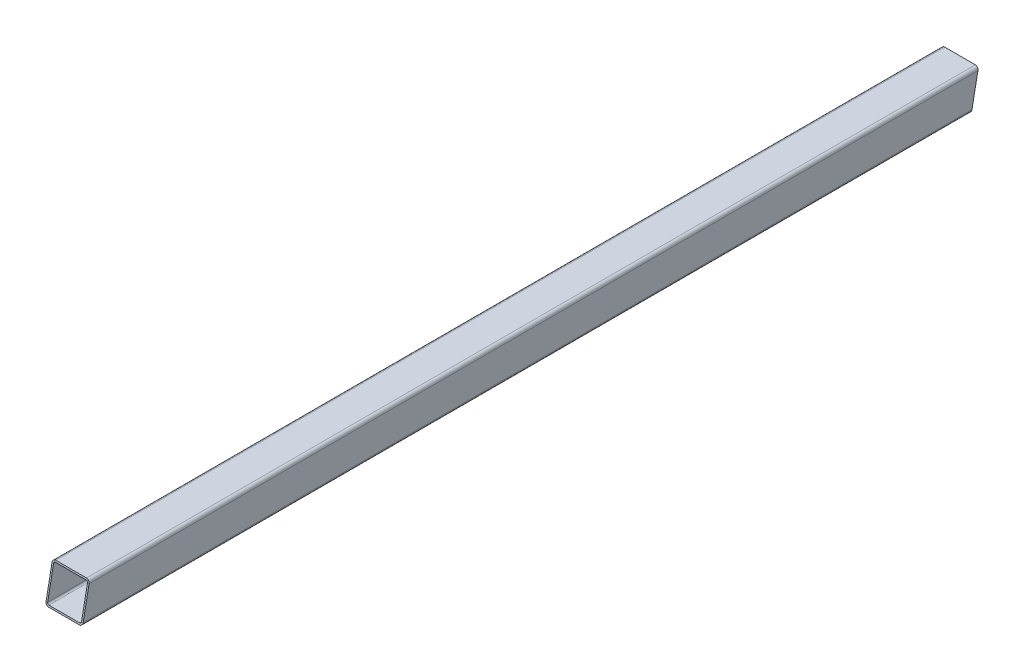
ISO-10303-21;
HEADER;
FILE_DESCRIPTION(('STEP AP214'),'2;1');
FILE_NAME('part.step','',(''),(''),'','','');
FILE_SCHEMA(('AUTOMOTIVE_DESIGN { 1 0 10303 214 1 1 1 1 }'));
ENDSEC;
DATA;
#1=APPLICATION_CONTEXT('core data for automotive mechanical design processes');
#2=APPLICATION_PROTOCOL_DEFINITION('international standard','automotive_design',2000,#1);
#3=PRODUCT_CONTEXT('',#1,'mechanical');
#4=PRODUCT('Part','Part','',(#3));
#5=PRODUCT_RELATED_PRODUCT_CATEGORY('part','',(#4));
#6=PRODUCT_DEFINITION_FORMATION('','',#4);
#7=PRODUCT_DEFINITION_CONTEXT('part definition',#1,'design');
#8=PRODUCT_DEFINITION('design','',#6,#7);
#9=PRODUCT_DEFINITION_SHAPE('','',#8);
#10=(LENGTH_UNIT() NAMED_UNIT(*) SI_UNIT(.MILLI.,.METRE.));
#11=(NAMED_UNIT(*) PLANE_ANGLE_UNIT() SI_UNIT($,.RADIAN.));
#12=(NAMED_UNIT(*) SI_UNIT($,.STERADIAN.) SOLID_ANGLE_UNIT());
#13=UNCERTAINTY_MEASURE_WITH_UNIT(LENGTH_MEASURE(1.E-05),#10,'distance_accuracy_value','');
#14=(GEOMETRIC_REPRESENTATION_CONTEXT(3) GLOBAL_UNCERTAINTY_ASSIGNED_CONTEXT((#13)) GLOBAL_UNIT_ASSIGNED_CONTEXT((#10,
#11,#12)) REPRESENTATION_CONTEXT('',''));
#15=CARTESIAN_POINT('',(0.,0.,0.));
#16=DIRECTION('',(0.,0.,1.));
#17=DIRECTION('',(1.,0.,0.));
#18=AXIS2_PLACEMENT_3D('',#15,#16,#17);
#19=CARTESIAN_POINT('',(20.4670487106017,0.,1693.));
#20=DIRECTION('',(1.,0.,0.));
#21=DIRECTION('',(0.,1.,0.));
#22=AXIS2_PLACEMENT_3D('',#19,#20,#21);
#23=PLANE('',#22);
#24=DIRECTION('',(0.,0.,-1.));
#25=VECTOR('',#24,1.);
#26=CARTESIAN_POINT('',(20.4670487106017,-26.9856733524355,1693.));
#27=LINE('',#26,#25);
#28=CARTESIAN_POINT('',(20.4670487106017,-26.9856733524355,1691.83428571429));
#29=VERTEX_POINT('',#28);
#30=CARTESIAN_POINT('',(20.4670487106017,-26.9856733524355,12.4342857142856));
#31=VERTEX_POINT('',#30);
#32=EDGE_CURVE('E365',#29,#31,#27,.T.);
#33=ORIENTED_EDGE('',*,*,#32,.F.);
#34=DIRECTION('',(0.,0.981644572077095,-0.190719516860694));
#35=VECTOR('',#34,1.);
#36=CARTESIAN_POINT('',(20.4670487106017,-1.19981870914747,1686.82446252645));
#37=LINE('',#36,#35);
#38=CARTESIAN_POINT('',(20.4670487106017,31.0143266475644,1680.56571428571));
#39=VERTEX_POINT('',#38);
#40=EDGE_CURVE('E435',#29,#39,#37,.T.);
#41=ORIENTED_EDGE('',*,*,#40,.T.);
#42=DIRECTION('',(0.,0.,-1.));
#43=VECTOR('',#42,1.);
#44=CARTESIAN_POINT('',(20.4670487106017,31.0143266475644,1693.));
#45=LINE('',#44,#43);
#46=CARTESIAN_POINT('',(20.4670487106017,31.0143266475644,1.16571428571444));
#47=VERTEX_POINT('',#46);
#48=EDGE_CURVE('E209',#39,#47,#45,.T.);
#49=ORIENTED_EDGE('',*,*,#48,.T.);
#50=DIRECTION('',(0.,-0.981644572077096,0.190719516860693));
#51=VECTOR('',#50,1.);
#52=CARTESIAN_POINT('',(20.4670487106018,-315.61503534802,68.5108474734282));
#53=LINE('',#52,#51);
#54=EDGE_CURVE('E381',#47,#31,#53,.T.);
#55=ORIENTED_EDGE('',*,*,#54,.T.);
#56=EDGE_LOOP('',(#33,#41,#49,#55));
#57=FACE_BOUND('',#56,.T.);
#58=ADVANCED_FACE('F185',(#57),#23,.F.);
#59=CARTESIAN_POINT('',(17.4670487106017,-26.9856733524355,1693.));
#60=DIRECTION('',(0.,0.,-1.));
#61=DIRECTION('',(-1.,0.,0.));
#62=AXIS2_PLACEMENT_3D('',#59,#60,#61);
#63=CYLINDRICAL_SURFACE('',#62,3.);
#64=DIRECTION('',(0.,0.,-1.));
#65=VECTOR('',#64,1.);
#66=CARTESIAN_POINT('',(17.4670487106017,-29.9856733524355,1693.));
#67=LINE('',#66,#65);
#68=CARTESIAN_POINT('',(17.4670487106017,-29.9856733524355,1692.41714285714));
#69=VERTEX_POINT('',#68);
#70=CARTESIAN_POINT('',(17.4670487106017,-29.9856733524355,13.0171428571431));
#71=VERTEX_POINT('',#70);
#72=EDGE_CURVE('E362',#69,#71,#67,.T.);
#73=ORIENTED_EDGE('',*,*,#72,.F.);
#74=CARTESIAN_POINT('',(17.4670487106017,-26.9856733524355,1691.83428571429));
#75=DIRECTION('',(0.,-0.190719516860694,-0.981644572077095));
#76=DIRECTION('',(0.,0.981644572077095,-0.190719516860694));
#77=AXIS2_PLACEMENT_3D('',#74,#75,#76);
#78=ELLIPSE('',#77,3.0560959489158,3.);
#79=EDGE_CURVE('E438',#69,#29,#78,.F.);
#80=ORIENTED_EDGE('',*,*,#79,.T.);
#81=ORIENTED_EDGE('',*,*,#32,.T.);
#82=CARTESIAN_POINT('',(17.4670487106017,-26.9856733524355,12.4342857142856));
#83=DIRECTION('',(0.,0.190719516860693,0.981644572077096));
#84=DIRECTION('',(0.,0.981644572077096,-0.190719516860693));
#85=AXIS2_PLACEMENT_3D('',#82,#83,#84);
#86=ELLIPSE('',#85,3.0560959489158,3.);
#87=EDGE_CURVE('E386',#31,#71,#86,.F.);
#88=ORIENTED_EDGE('',*,*,#87,.T.);
#89=EDGE_LOOP('',(#73,#80,#81,#88));
#90=FACE_BOUND('',#89,.T.);
#91=ADVANCED_FACE('F507',(#90),#63,.F.);
#92=CARTESIAN_POINT('',(0.,-29.9856733524355,1693.));
#93=DIRECTION('',(0.,-1.,0.));
#94=DIRECTION('',(1.,0.,0.));
#95=AXIS2_PLACEMENT_3D('',#92,#93,#94);
#96=PLANE('',#95);
#97=DIRECTION('',(0.,0.,-1.));
#98=VECTOR('',#97,1.);
#99=CARTESIAN_POINT('',(-40.5329512893982,-29.9856733524355,1693.));
#100=LINE('',#99,#98);
#101=CARTESIAN_POINT('',(-40.5329512893982,-29.9856733524355,1692.41714285714));
#102=VERTEX_POINT('',#101);
#103=CARTESIAN_POINT('',(-40.5329512893982,-29.9856733524355,13.0171428571428));
#104=VERTEX_POINT('',#103);
#105=EDGE_CURVE('E359',#102,#104,#100,.T.);
#106=ORIENTED_EDGE('',*,*,#105,.F.);
#107=DIRECTION('',(1.,0.,0.));
#108=VECTOR('',#107,1.);
#109=CARTESIAN_POINT('',(0.,-29.9856733524355,1692.41714285714));
#110=LINE('',#109,#108);
#111=EDGE_CURVE('E442',#102,#69,#110,.T.);
#112=ORIENTED_EDGE('',*,*,#111,.T.);
#113=ORIENTED_EDGE('',*,*,#72,.T.);
#114=DIRECTION('',(-1.,0.,0.));
#115=VECTOR('',#114,1.);
#116=CARTESIAN_POINT('',(0.,-29.9856733524355,13.0171428571431));
#117=LINE('',#116,#115);
#118=EDGE_CURVE('E390',#71,#104,#117,.T.);
#119=ORIENTED_EDGE('',*,*,#118,.T.);
#120=EDGE_LOOP('',(#106,#112,#113,#119));
#121=FACE_BOUND('',#120,.T.);
#122=ADVANCED_FACE('F511',(#121),#96,.F.);
#123=CARTESIAN_POINT('',(-40.5329512893983,-26.9856733524355,1693.));
#124=DIRECTION('',(0.,0.,-1.));
#125=DIRECTION('',(-1.,0.,0.));
#126=AXIS2_PLACEMENT_3D('',#123,#124,#125);
#127=CYLINDRICAL_SURFACE('',#126,3.);
#128=DIRECTION('',(0.,0.,-1.));
#129=VECTOR('',#128,1.);
#130=CARTESIAN_POINT('',(-43.5329512893983,-26.9856733524355,1693.));
#131=LINE('',#130,#129);
#132=CARTESIAN_POINT('',(-43.5329512893983,-26.9856733524355,1691.83428571429));
#133=VERTEX_POINT('',#132);
#134=CARTESIAN_POINT('',(-43.5329512893983,-26.9856733524355,12.4342857142861));
#135=VERTEX_POINT('',#134);
#136=EDGE_CURVE('E356',#133,#135,#131,.T.);
#137=ORIENTED_EDGE('',*,*,#136,.F.);
#138=CARTESIAN_POINT('',(-40.5329512893983,-26.9856733524355,1691.83428571429));
#139=DIRECTION('',(0.,-0.190719516860694,-0.981644572077095));
#140=DIRECTION('',(0.,0.981644572077095,-0.190719516860694));
#141=AXIS2_PLACEMENT_3D('',#138,#139,#140);
#142=ELLIPSE('',#141,3.05609594891581,3.);
#143=EDGE_CURVE('E446',#133,#102,#142,.F.);
#144=ORIENTED_EDGE('',*,*,#143,.T.);
#145=ORIENTED_EDGE('',*,*,#105,.T.);
#146=CARTESIAN_POINT('',(-40.5329512893983,-26.9856733524355,12.4342857142856));
#147=DIRECTION('',(0.,0.190719516860693,0.981644572077096));
#148=DIRECTION('',(0.,0.981644572077096,-0.190719516860693));
#149=AXIS2_PLACEMENT_3D('',#146,#147,#148);
#150=ELLIPSE('',#149,3.05609594891581,3.);
#151=EDGE_CURVE('E394',#104,#135,#150,.F.);
#152=ORIENTED_EDGE('',*,*,#151,.T.);
#153=EDGE_LOOP('',(#137,#144,#145,#152));
#154=FACE_BOUND('',#153,.T.);
#155=ADVANCED_FACE('F518',(#154),#127,.F.);
#156=CARTESIAN_POINT('',(-43.5329512893983,0.,1693.));
#157=DIRECTION('',(1.,0.,0.));
#158=DIRECTION('',(0.,0.,-1.));
#159=AXIS2_PLACEMENT_3D('',#156,#157,#158);
#160=PLANE('',#159);
#161=DIRECTION('',(0.,0.981644572077095,-0.190719516860694));
#162=VECTOR('',#161,1.);
#163=CARTESIAN_POINT('',(-43.5329512893983,-1.19981870914747,1686.82446252645));
#164=LINE('',#163,#162);
#165=CARTESIAN_POINT('',(-43.5329512893983,31.0143266475644,1680.56571428571));
#166=VERTEX_POINT('',#165);
#167=EDGE_CURVE('E450',#133,#166,#164,.T.);
#168=ORIENTED_EDGE('',*,*,#167,.F.);
#169=ORIENTED_EDGE('',*,*,#136,.T.);
#170=DIRECTION('',(0.,-0.981644572077096,0.190719516860693));
#171=VECTOR('',#170,1.);
#172=CARTESIAN_POINT('',(-43.5329512893983,-315.61503534802,68.5108474734282));
#173=LINE('',#172,#171);
#174=CARTESIAN_POINT('',(-43.5329512893983,31.0143266475644,1.16571428571444));
#175=VERTEX_POINT('',#174);
#176=EDGE_CURVE('E398',#175,#135,#173,.T.);
#177=ORIENTED_EDGE('',*,*,#176,.F.);
#178=DIRECTION('',(0.,0.,-1.));
#179=VECTOR('',#178,1.);
#180=CARTESIAN_POINT('',(-43.5329512893983,31.0143266475644,1693.));
#181=LINE('',#180,#179);
#182=EDGE_CURVE('E353',#166,#175,#181,.T.);
#183=ORIENTED_EDGE('',*,*,#182,.F.);
#184=EDGE_LOOP('',(#168,#169,#177,#183));
#185=FACE_BOUND('',#184,.T.);
#186=ADVANCED_FACE('F522',(#185),#160,.T.);
#187=CARTESIAN_POINT('',(-40.5329512893983,31.0143266475645,1693.));
#188=DIRECTION('',(0.,0.,-1.));
#189=DIRECTION('',(-1.,0.,0.));
#190=AXIS2_PLACEMENT_3D('',#187,#188,#189);
#191=CYLINDRICAL_SURFACE('',#190,3.);
#192=DIRECTION('',(0.,0.,-1.));
#193=VECTOR('',#192,1.);
#194=CARTESIAN_POINT('',(-40.5329512893982,34.0143266475645,1693.));
#195=LINE('',#194,#193);
#196=CARTESIAN_POINT('',(-40.5329512893982,34.0143266475645,1679.98285714286));
#197=VERTEX_POINT('',#196);
#198=CARTESIAN_POINT('',(-40.5329512893982,34.0143266475645,0.582857142857218));
#199=VERTEX_POINT('',#198);
#200=EDGE_CURVE('E350',#197,#199,#195,.T.);
#201=ORIENTED_EDGE('',*,*,#200,.F.);
#202=CARTESIAN_POINT('',(-40.5329512893983,31.0143266475645,1680.56571428571));
#203=DIRECTION('',(0.,-0.190719516860694,-0.981644572077095));
#204=DIRECTION('',(0.,0.981644572077095,-0.190719516860694));
#205=AXIS2_PLACEMENT_3D('',#202,#203,#204);
#206=ELLIPSE('',#205,3.05609594891581,3.);
#207=EDGE_CURVE('E453',#197,#166,#206,.F.);
#208=ORIENTED_EDGE('',*,*,#207,.T.);
#209=ORIENTED_EDGE('',*,*,#182,.T.);
#210=CARTESIAN_POINT('',(-40.5329512893983,31.0143266475645,1.16571428571444));
#211=DIRECTION('',(0.,0.190719516860693,0.981644572077096));
#212=DIRECTION('',(0.,0.981644572077096,-0.190719516860693));
#213=AXIS2_PLACEMENT_3D('',#210,#211,#212);
#214=ELLIPSE('',#213,3.05609594891581,3.);
#215=EDGE_CURVE('E402',#175,#199,#214,.F.);
#216=ORIENTED_EDGE('',*,*,#215,.T.);
#217=EDGE_LOOP('',(#201,#208,#209,#216));
#218=FACE_BOUND('',#217,.T.);
#219=ADVANCED_FACE('F526',(#218),#191,.F.);
#220=CARTESIAN_POINT('',(0.,34.0143266475645,1693.));
#221=DIRECTION('',(0.,-1.,0.));
#222=DIRECTION('',(1.,0.,0.));
#223=AXIS2_PLACEMENT_3D('',#220,#221,#222);
#224=PLANE('',#223);
#225=DIRECTION('',(1.,0.,0.));
#226=VECTOR('',#225,1.);
#227=CARTESIAN_POINT('',(0.,34.0143266475645,1679.98285714286));
#228=LINE('',#227,#226);
#229=CARTESIAN_POINT('',(17.4670487106017,34.0143266475645,1679.98285714286));
#230=VERTEX_POINT('',#229);
#231=EDGE_CURVE('E201',#197,#230,#228,.T.);
#232=ORIENTED_EDGE('',*,*,#231,.F.);
#233=ORIENTED_EDGE('',*,*,#200,.T.);
#234=DIRECTION('',(-1.,0.,0.));
#235=VECTOR('',#234,1.);
#236=CARTESIAN_POINT('',(0.,34.0143266475645,0.582857142857218));
#237=LINE('',#236,#235);
#238=CARTESIAN_POINT('',(17.4670487106017,34.0143266475645,0.58285714285744));
#239=VERTEX_POINT('',#238);
#240=EDGE_CURVE('E406',#239,#199,#237,.T.);
#241=ORIENTED_EDGE('',*,*,#240,.F.);
#242=DIRECTION('',(0.,0.,-1.));
#243=VECTOR('',#242,1.);
#244=CARTESIAN_POINT('',(17.4670487106017,34.0143266475645,1693.));
#245=LINE('',#244,#243);
#246=EDGE_CURVE('E347',#230,#239,#245,.T.);
#247=ORIENTED_EDGE('',*,*,#246,.F.);
#248=EDGE_LOOP('',(#232,#233,#241,#247));
#249=FACE_BOUND('',#248,.T.);
#250=ADVANCED_FACE('F530',(#249),#224,.T.);
#251=CARTESIAN_POINT('',(17.4670487106017,31.0143266475645,1693.));
#252=DIRECTION('',(0.,0.,-1.));
#253=DIRECTION('',(-1.,0.,0.));
#254=AXIS2_PLACEMENT_3D('',#251,#252,#253);
#255=CYLINDRICAL_SURFACE('',#254,3.);
#256=CARTESIAN_POINT('',(17.4670487106017,31.0143266475645,1680.56571428571));
#257=DIRECTION('',(0.,-0.190719516860694,-0.981644572077095));
#258=DIRECTION('',(0.,0.981644572077095,-0.190719516860694));
#259=AXIS2_PLACEMENT_3D('',#256,#257,#258);
#260=ELLIPSE('',#259,3.0560959489158,3.);
#261=EDGE_CURVE('E459',#230,#39,#260,.T.);
#262=ORIENTED_EDGE('',*,*,#261,.F.);
#263=ORIENTED_EDGE('',*,*,#246,.T.);
#264=CARTESIAN_POINT('',(17.4670487106017,31.0143266475645,1.16571428571444));
#265=DIRECTION('',(0.,0.190719516860693,0.981644572077096));
#266=DIRECTION('',(0.,0.981644572077096,-0.190719516860693));
#267=AXIS2_PLACEMENT_3D('',#264,#265,#266);
#268=ELLIPSE('',#267,3.0560959489158,3.);
#269=EDGE_CURVE('E410',#47,#239,#268,.T.);
#270=ORIENTED_EDGE('',*,*,#269,.F.);
#271=ORIENTED_EDGE('',*,*,#48,.F.);
#272=EDGE_LOOP('',(#262,#263,#270,#271));
#273=FACE_BOUND('',#272,.T.);
#274=ADVANCED_FACE('F187',(#273),#255,.F.);
#275=CARTESIAN_POINT('',(0.,37.0143266475645,1693.));
#276=DIRECTION('',(0.,-1.,0.));
#277=DIRECTION('',(1.,0.,0.));
#278=AXIS2_PLACEMENT_3D('',#275,#276,#277);
#279=PLANE('',#278);
#280=DIRECTION('',(0.,0.,-1.));
#281=VECTOR('',#280,1.);
#282=CARTESIAN_POINT('',(-40.5329512893982,37.0143266475645,1693.));
#283=LINE('',#282,#281);
#284=CARTESIAN_POINT('',(-40.5329512893983,37.0143266475645,1679.4));
#285=VERTEX_POINT('',#284);
#286=CARTESIAN_POINT('',(-40.5329512893983,37.0143266475645,1.51354623278976E-13));
#287=VERTEX_POINT('',#286);
#288=EDGE_CURVE('E368',#285,#287,#283,.T.);
#289=ORIENTED_EDGE('',*,*,#288,.F.);
#290=DIRECTION('',(1.,0.,0.));
#291=VECTOR('',#290,1.);
#292=CARTESIAN_POINT('',(-1190.5329512894,37.0143266475643,1679.4));
#293=LINE('',#292,#291);
#294=CARTESIAN_POINT('',(17.4670487106017,37.0143266475645,1679.4));
#295=VERTEX_POINT('',#294);
#296=EDGE_CURVE('E323',#285,#295,#293,.T.);
#297=ORIENTED_EDGE('',*,*,#296,.T.);
#298=DIRECTION('',(0.,0.,-1.));
#299=VECTOR('',#298,1.);
#300=CARTESIAN_POINT('',(17.4670487106017,37.0143266475645,1693.));
#301=LINE('',#300,#299);
#302=CARTESIAN_POINT('',(17.4670487106017,37.0143266475645,1.50920942409982E-13));
#303=VERTEX_POINT('',#302);
#304=EDGE_CURVE('E335',#295,#303,#301,.T.);
#305=ORIENTED_EDGE('',*,*,#304,.T.);
#306=DIRECTION('',(-1.,0.,0.));
#307=VECTOR('',#306,1.);
#308=CARTESIAN_POINT('',(0.,37.0143266475645,0.));
#309=LINE('',#308,#307);
#310=EDGE_CURVE('E377',#303,#287,#309,.T.);
#311=ORIENTED_EDGE('',*,*,#310,.T.);
#312=EDGE_LOOP('',(#289,#297,#305,#311));
#313=FACE_BOUND('',#312,.T.);
#314=ADVANCED_FACE('F477',(#313),#279,.F.);
#315=CARTESIAN_POINT('',(17.4670487106017,31.0143266475645,1693.));
#316=DIRECTION('',(0.,0.,-1.));
#317=DIRECTION('',(-1.,0.,0.));
#318=AXIS2_PLACEMENT_3D('',#315,#316,#317);
#319=CYLINDRICAL_SURFACE('',#318,6.);
#320=CARTESIAN_POINT('',(17.4670487106017,31.0143266475645,1680.56571428571));
#321=DIRECTION('',(0.,-0.190719516860694,-0.981644572077095));
#322=DIRECTION('',(0.,0.981644572077095,-0.190719516860694));
#323=AXIS2_PLACEMENT_3D('',#320,#321,#322);
#324=ELLIPSE('',#323,6.11219189783161,6.);
#325=CARTESIAN_POINT('',(23.4670487106017,31.0143266475644,1680.56571428571));
#326=VERTEX_POINT('',#325);
#327=EDGE_CURVE('E312',#326,#295,#324,.F.);
#328=ORIENTED_EDGE('',*,*,#327,.F.);
#329=DIRECTION('',(0.,0.,-1.));
#330=VECTOR('',#329,1.);
#331=CARTESIAN_POINT('',(23.4670487106017,31.0143266475644,1693.));
#332=LINE('',#331,#330);
#333=CARTESIAN_POINT('',(23.4670487106017,31.0143266475644,1.1657142857143));
#334=VERTEX_POINT('',#333);
#335=EDGE_CURVE('E321',#326,#334,#332,.T.);
#336=ORIENTED_EDGE('',*,*,#335,.T.);
#337=CARTESIAN_POINT('',(17.4670487106017,31.0143266475645,1.16571428571444));
#338=DIRECTION('',(0.,0.190719516860693,0.981644572077096));
#339=DIRECTION('',(0.,0.981644572077096,-0.190719516860693));
#340=AXIS2_PLACEMENT_3D('',#337,#338,#339);
#341=ELLIPSE('',#340,6.11219189783161,6.);
#342=EDGE_CURVE('E414',#303,#334,#341,.F.);
#343=ORIENTED_EDGE('',*,*,#342,.F.);
#344=ORIENTED_EDGE('',*,*,#304,.F.);
#345=EDGE_LOOP('',(#328,#336,#343,#344));
#346=FACE_BOUND('',#345,.T.);
#347=ADVANCED_FACE('F481',(#346),#319,.T.);
#348=CARTESIAN_POINT('',(23.4670487106017,0.,1693.));
#349=DIRECTION('',(1.,0.,0.));
#350=DIRECTION('',(0.,1.,0.));
#351=AXIS2_PLACEMENT_3D('',#348,#349,#350);
#352=PLANE('',#351);
#353=DIRECTION('',(0.,0.981644572077095,-0.190719516860694));
#354=VECTOR('',#353,1.);
#355=CARTESIAN_POINT('',(23.4670487106017,37.0143266475645,1679.4));
#356=LINE('',#355,#354);
#357=CARTESIAN_POINT('',(23.4670487106017,-26.9856733524355,1691.83428571429));
#358=VERTEX_POINT('',#357);
#359=EDGE_CURVE('E303',#358,#326,#356,.T.);
#360=ORIENTED_EDGE('',*,*,#359,.F.);
#361=DIRECTION('',(0.,0.,-1.));
#362=VECTOR('',#361,1.);
#363=CARTESIAN_POINT('',(23.4670487106017,-26.9856733524355,1693.));
#364=LINE('',#363,#362);
#365=CARTESIAN_POINT('',(23.4670487106017,-26.9856733524355,12.4342857142857));
#366=VERTEX_POINT('',#365);
#367=EDGE_CURVE('E319',#358,#366,#364,.T.);
#368=ORIENTED_EDGE('',*,*,#367,.T.);
#369=DIRECTION('',(0.,-0.981644572077096,0.190719516860693));
#370=VECTOR('',#369,1.);
#371=CARTESIAN_POINT('',(23.4670487106017,-32.9856733524355,13.6));
#372=LINE('',#371,#370);
#373=EDGE_CURVE('E432',#334,#366,#372,.T.);
#374=ORIENTED_EDGE('',*,*,#373,.F.);
#375=ORIENTED_EDGE('',*,*,#335,.F.);
#376=EDGE_LOOP('',(#360,#368,#374,#375));
#377=FACE_BOUND('',#376,.T.);
#378=ADVANCED_FACE('F317',(#377),#352,.T.);
#379=CARTESIAN_POINT('',(17.4670487106017,-26.9856733524355,1693.));
#380=DIRECTION('',(0.,0.,-1.));
#381=DIRECTION('',(-1.,0.,0.));
#382=AXIS2_PLACEMENT_3D('',#379,#380,#381);
#383=CYLINDRICAL_SURFACE('',#382,6.);
#384=CARTESIAN_POINT('',(17.4670487106017,-26.9856733524355,1691.83428571429));
#385=DIRECTION('',(0.,-0.190719516860694,-0.981644572077095));
#386=DIRECTION('',(0.,0.981644572077095,-0.190719516860694));
#387=AXIS2_PLACEMENT_3D('',#384,#385,#386);
#388=ELLIPSE('',#387,6.11219189783161,6.);
#389=CARTESIAN_POINT('',(17.4670487106017,-32.9856733524355,1693.));
#390=VERTEX_POINT('',#389);
#391=EDGE_CURVE('E300',#390,#358,#388,.F.);
#392=ORIENTED_EDGE('',*,*,#391,.F.);
#393=DIRECTION('',(0.,0.,-1.));
#394=VECTOR('',#393,1.);
#395=CARTESIAN_POINT('',(17.4670487106017,-32.9856733524355,1693.));
#396=LINE('',#395,#394);
#397=CARTESIAN_POINT('',(17.4670487106017,-32.9856733524355,13.6));
#398=VERTEX_POINT('',#397);
#399=EDGE_CURVE('E329',#390,#398,#396,.T.);
#400=ORIENTED_EDGE('',*,*,#399,.T.);
#401=CARTESIAN_POINT('',(17.4670487106017,-26.9856733524355,12.4342857142856));
#402=DIRECTION('',(0.,0.190719516860693,0.981644572077096));
#403=DIRECTION('',(0.,0.981644572077096,-0.190719516860693));
#404=AXIS2_PLACEMENT_3D('',#401,#402,#403);
#405=ELLIPSE('',#404,6.11219189783161,6.);
#406=EDGE_CURVE('E327',#366,#398,#405,.F.);
#407=ORIENTED_EDGE('',*,*,#406,.F.);
#408=ORIENTED_EDGE('',*,*,#367,.F.);
#409=EDGE_LOOP('',(#392,#400,#407,#408));
#410=FACE_BOUND('',#409,.T.);
#411=ADVANCED_FACE('F326',(#410),#383,.T.);
#412=CARTESIAN_POINT('',(0.,-32.9856733524355,1693.));
#413=DIRECTION('',(0.,-1.,0.));
#414=DIRECTION('',(1.,0.,0.));
#415=AXIS2_PLACEMENT_3D('',#412,#413,#414);
#416=PLANE('',#415);
#417=DIRECTION('',(1.,0.,0.));
#418=VECTOR('',#417,1.);
#419=CARTESIAN_POINT('',(-1190.5329512894,-32.9856733524357,13.6));
#420=LINE('',#419,#418);
#421=CARTESIAN_POINT('',(-40.5329512893983,-32.9856733524355,13.5999999999999));
#422=VERTEX_POINT('',#421);
#423=EDGE_CURVE('E428',#422,#398,#420,.T.);
#424=ORIENTED_EDGE('',*,*,#423,.T.);
#425=ORIENTED_EDGE('',*,*,#399,.F.);
#426=DIRECTION('',(-1.,0.,0.));
#427=VECTOR('',#426,1.);
#428=CARTESIAN_POINT('',(0.,-32.9856733524355,1693.));
#429=LINE('',#428,#427);
#430=CARTESIAN_POINT('',(-40.5329512893982,-32.9856733524355,1693.));
#431=VERTEX_POINT('',#430);
#432=EDGE_CURVE('E306',#390,#431,#429,.T.);
#433=ORIENTED_EDGE('',*,*,#432,.T.);
#434=DIRECTION('',(0.,0.,-1.));
#435=VECTOR('',#434,1.);
#436=CARTESIAN_POINT('',(-40.5329512893982,-32.9856733524355,1693.));
#437=LINE('',#436,#435);
#438=EDGE_CURVE('E333',#431,#422,#437,.T.);
#439=ORIENTED_EDGE('',*,*,#438,.T.);
#440=EDGE_LOOP('',(#424,#425,#433,#439));
#441=FACE_BOUND('',#440,.T.);
#442=ADVANCED_FACE('F497',(#441),#416,.T.);
#443=CARTESIAN_POINT('',(-40.5329512893983,-26.9856733524355,1693.));
#444=DIRECTION('',(0.,0.,-1.));
#445=DIRECTION('',(-1.,0.,0.));
#446=AXIS2_PLACEMENT_3D('',#443,#444,#445);
#447=CYLINDRICAL_SURFACE('',#446,6.);
#448=CARTESIAN_POINT('',(-40.5329512893983,-26.9856733524355,1691.83428571429));
#449=DIRECTION('',(0.,-0.190719516860694,-0.981644572077095));
#450=DIRECTION('',(0.,0.981644572077095,-0.190719516860694));
#451=AXIS2_PLACEMENT_3D('',#448,#449,#450);
#452=ELLIPSE('',#451,6.11219189783161,6.);
#453=CARTESIAN_POINT('',(-46.5329512893983,-26.9856733524355,1691.83428571429));
#454=VERTEX_POINT('',#453);
#455=EDGE_CURVE('E313',#454,#431,#452,.F.);
#456=ORIENTED_EDGE('',*,*,#455,.F.);
#457=DIRECTION('',(0.,0.,-1.));
#458=VECTOR('',#457,1.);
#459=CARTESIAN_POINT('',(-46.5329512893983,-26.9856733524355,1693.));
#460=LINE('',#459,#458);
#461=CARTESIAN_POINT('',(-46.5329512893983,-26.9856733524355,12.4342857142861));
#462=VERTEX_POINT('',#461);
#463=EDGE_CURVE('E342',#454,#462,#460,.T.);
#464=ORIENTED_EDGE('',*,*,#463,.T.);
#465=CARTESIAN_POINT('',(-40.5329512893983,-26.9856733524355,12.4342857142856));
#466=DIRECTION('',(0.,0.190719516860693,0.981644572077096));
#467=DIRECTION('',(0.,0.981644572077096,-0.190719516860693));
#468=AXIS2_PLACEMENT_3D('',#465,#466,#467);
#469=ELLIPSE('',#468,6.11219189783161,6.);
#470=EDGE_CURVE('E420',#422,#462,#469,.F.);
#471=ORIENTED_EDGE('',*,*,#470,.F.);
#472=ORIENTED_EDGE('',*,*,#438,.F.);
#473=EDGE_LOOP('',(#456,#464,#471,#472));
#474=FACE_BOUND('',#473,.T.);
#475=ADVANCED_FACE('F494',(#474),#447,.T.);
#476=CARTESIAN_POINT('',(-46.5329512893983,0.,1693.));
#477=DIRECTION('',(1.,0.,0.));
#478=DIRECTION('',(0.,0.,-1.));
#479=AXIS2_PLACEMENT_3D('',#476,#477,#478);
#480=PLANE('',#479);
#481=ORIENTED_EDGE('',*,*,#463,.F.);
#482=DIRECTION('',(0.,0.981644572077095,-0.190719516860694));
#483=VECTOR('',#482,1.);
#484=CARTESIAN_POINT('',(-46.5329512893983,-1.19981870914747,1686.82446252645));
#485=LINE('',#484,#483);
#486=CARTESIAN_POINT('',(-46.5329512893983,31.0143266475644,1680.56571428571));
#487=VERTEX_POINT('',#486);
#488=EDGE_CURVE('E466',#454,#487,#485,.T.);
#489=ORIENTED_EDGE('',*,*,#488,.T.);
#490=DIRECTION('',(0.,0.,-1.));
#491=VECTOR('',#490,1.);
#492=CARTESIAN_POINT('',(-46.5329512893983,31.0143266475644,1693.));
#493=LINE('',#492,#491);
#494=CARTESIAN_POINT('',(-46.5329512893983,31.0143266475644,1.16571428571444));
#495=VERTEX_POINT('',#494);
#496=EDGE_CURVE('E194',#487,#495,#493,.T.);
#497=ORIENTED_EDGE('',*,*,#496,.T.);
#498=DIRECTION('',(0.,-0.981644572077096,0.190719516860693));
#499=VECTOR('',#498,1.);
#500=CARTESIAN_POINT('',(-46.5329512893983,-315.61503534802,68.5108474734282));
#501=LINE('',#500,#499);
#502=EDGE_CURVE('E424',#495,#462,#501,.T.);
#503=ORIENTED_EDGE('',*,*,#502,.T.);
#504=EDGE_LOOP('',(#481,#489,#497,#503));
#505=FACE_BOUND('',#504,.T.);
#506=ADVANCED_FACE('F490',(#505),#480,.F.);
#507=CARTESIAN_POINT('',(-40.5329512893983,31.0143266475645,1693.));
#508=DIRECTION('',(0.,0.,-1.));
#509=DIRECTION('',(-1.,0.,0.));
#510=AXIS2_PLACEMENT_3D('',#507,#508,#509);
#511=CYLINDRICAL_SURFACE('',#510,6.);
#512=CARTESIAN_POINT('',(-40.5329512893983,31.0143266475645,1680.56571428571));
#513=DIRECTION('',(0.,-0.190719516860694,-0.981644572077095));
#514=DIRECTION('',(0.,0.981644572077095,-0.190719516860694));
#515=AXIS2_PLACEMENT_3D('',#512,#513,#514);
#516=ELLIPSE('',#515,6.11219189783161,6.);
#517=EDGE_CURVE('E470',#285,#487,#516,.F.);
#518=ORIENTED_EDGE('',*,*,#517,.F.);
#519=ORIENTED_EDGE('',*,*,#288,.T.);
#520=CARTESIAN_POINT('',(-40.5329512893983,31.0143266475645,1.16571428571444));
#521=DIRECTION('',(0.,0.190719516860693,0.981644572077096));
#522=DIRECTION('',(0.,0.981644572077096,-0.190719516860693));
#523=AXIS2_PLACEMENT_3D('',#520,#521,#522);
#524=ELLIPSE('',#523,6.11219189783161,6.);
#525=EDGE_CURVE('E12',#495,#287,#524,.F.);
#526=ORIENTED_EDGE('',*,*,#525,.F.);
#527=ORIENTED_EDGE('',*,*,#496,.F.);
#528=EDGE_LOOP('',(#518,#519,#526,#527));
#529=FACE_BOUND('',#528,.T.);
#530=ADVANCED_FACE('F487',(#529),#511,.T.);
#531=CARTESIAN_POINT('',(-1190.5329512894,-32.9856733524357,13.6));
#532=DIRECTION('',(0.,0.190719516860693,0.981644572077096));
#533=DIRECTION('',(0.,-0.981644572077096,0.190719516860693));
#534=AXIS2_PLACEMENT_3D('',#531,#532,#533);
#535=PLANE('',#534);
#536=ORIENTED_EDGE('',*,*,#342,.T.);
#537=ORIENTED_EDGE('',*,*,#373,.T.);
#538=ORIENTED_EDGE('',*,*,#406,.T.);
#539=ORIENTED_EDGE('',*,*,#423,.F.);
#540=ORIENTED_EDGE('',*,*,#470,.T.);
#541=ORIENTED_EDGE('',*,*,#502,.F.);
#542=ORIENTED_EDGE('',*,*,#525,.T.);
#543=ORIENTED_EDGE('',*,*,#310,.F.);
#544=EDGE_LOOP('',(#536,#537,#538,#539,#540,#541,#542,#543));
#545=FACE_BOUND('',#544,.T.);
#546=ORIENTED_EDGE('',*,*,#269,.T.);
#547=ORIENTED_EDGE('',*,*,#240,.T.);
#548=ORIENTED_EDGE('',*,*,#215,.F.);
#549=ORIENTED_EDGE('',*,*,#176,.T.);
#550=ORIENTED_EDGE('',*,*,#151,.F.);
#551=ORIENTED_EDGE('',*,*,#118,.F.);
#552=ORIENTED_EDGE('',*,*,#87,.F.);
#553=ORIENTED_EDGE('',*,*,#54,.F.);
#554=EDGE_LOOP('',(#546,#547,#548,#549,#550,#551,#552,#553));
#555=FACE_BOUND('',#554,.T.);
#556=ADVANCED_FACE('F483',(#545,#555),#535,.F.);
#557=CARTESIAN_POINT('',(-1190.5329512894,37.0143266475643,1679.4));
#558=DIRECTION('',(0.,-0.190719516860694,-0.981644572077095));
#559=DIRECTION('',(0.,0.981644572077095,-0.190719516860694));
#560=AXIS2_PLACEMENT_3D('',#557,#558,#559);
#561=PLANE('',#560);
#562=ORIENTED_EDGE('',*,*,#327,.T.);
#563=ORIENTED_EDGE('',*,*,#296,.F.);
#564=ORIENTED_EDGE('',*,*,#517,.T.);
#565=ORIENTED_EDGE('',*,*,#488,.F.);
#566=ORIENTED_EDGE('',*,*,#455,.T.);
#567=ORIENTED_EDGE('',*,*,#432,.F.);
#568=ORIENTED_EDGE('',*,*,#391,.T.);
#569=ORIENTED_EDGE('',*,*,#359,.T.);
#570=EDGE_LOOP('',(#562,#563,#564,#565,#566,#567,#568,#569));
#571=FACE_BOUND('',#570,.T.);
#572=ORIENTED_EDGE('',*,*,#79,.F.);
#573=ORIENTED_EDGE('',*,*,#111,.F.);
#574=ORIENTED_EDGE('',*,*,#143,.F.);
#575=ORIENTED_EDGE('',*,*,#167,.T.);
#576=ORIENTED_EDGE('',*,*,#207,.F.);
#577=ORIENTED_EDGE('',*,*,#231,.T.);
#578=ORIENTED_EDGE('',*,*,#261,.T.);
#579=ORIENTED_EDGE('',*,*,#40,.F.);
#580=EDGE_LOOP('',(#572,#573,#574,#575,#576,#577,#578,#579));
#581=FACE_BOUND('',#580,.T.);
#582=ADVANCED_FACE('F302',(#571,#581),#561,.F.);
#583=CLOSED_SHELL('',(#58,#91,#122,#155,#186,#219,#250,#274,#314,#347,#378,#411,#442,#475,#506,
#530,#556,#582));
#584=MANIFOLD_SOLID_BREP('B2',#583);
#585=ADVANCED_BREP_SHAPE_REPRESENTATION('',(#18,#584),#14);
#586=SHAPE_DEFINITION_REPRESENTATION(#9,#585);
ENDSEC;
END-ISO-10303-21;
